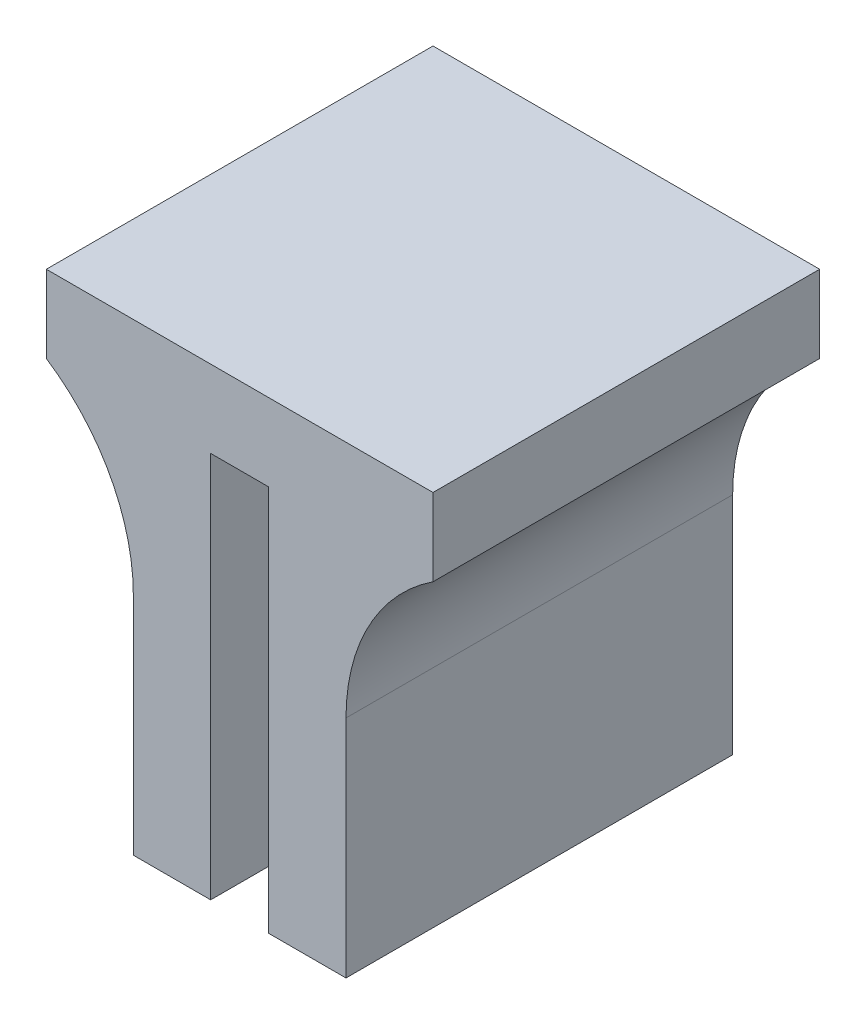
ISO-10303-21;
HEADER;
FILE_DESCRIPTION(('STEP AP214'),'2;1');
FILE_NAME('part.step','',(''),(''),'','','');
FILE_SCHEMA(('AUTOMOTIVE_DESIGN { 1 0 10303 214 1 1 1 1 }'));
ENDSEC;
DATA;
#1=APPLICATION_CONTEXT('core data for automotive mechanical design processes');
#2=APPLICATION_PROTOCOL_DEFINITION('international standard','automotive_design',2000,#1);
#3=PRODUCT_CONTEXT('',#1,'mechanical');
#4=PRODUCT('Part','Part','',(#3));
#5=PRODUCT_RELATED_PRODUCT_CATEGORY('part','',(#4));
#6=PRODUCT_DEFINITION_FORMATION('','',#4);
#7=PRODUCT_DEFINITION_CONTEXT('part definition',#1,'design');
#8=PRODUCT_DEFINITION('design','',#6,#7);
#9=PRODUCT_DEFINITION_SHAPE('','',#8);
#10=(LENGTH_UNIT() NAMED_UNIT(*) SI_UNIT(.MILLI.,.METRE.));
#11=(NAMED_UNIT(*) PLANE_ANGLE_UNIT() SI_UNIT($,.RADIAN.));
#12=(NAMED_UNIT(*) SI_UNIT($,.STERADIAN.) SOLID_ANGLE_UNIT());
#13=UNCERTAINTY_MEASURE_WITH_UNIT(LENGTH_MEASURE(1.E-05),#10,'distance_accuracy_value','');
#14=(GEOMETRIC_REPRESENTATION_CONTEXT(3) GLOBAL_UNCERTAINTY_ASSIGNED_CONTEXT((#13)) GLOBAL_UNIT_ASSIGNED_CONTEXT((#10,
#11,#12)) REPRESENTATION_CONTEXT('',''));
#15=CARTESIAN_POINT('',(0.,0.,0.));
#16=DIRECTION('',(0.,0.,1.));
#17=DIRECTION('',(1.,0.,0.));
#18=AXIS2_PLACEMENT_3D('',#15,#16,#17);
#19=CARTESIAN_POINT('',(-4.,0.,20.));
#20=DIRECTION('',(0.,1.,0.));
#21=DIRECTION('',(0.,0.,1.));
#22=AXIS2_PLACEMENT_3D('',#19,#20,#21);
#23=PLANE('',#22);
#24=DIRECTION('',(1.,0.,0.));
#25=VECTOR('',#24,1.);
#26=CARTESIAN_POINT('',(-4.,0.,0.));
#27=LINE('',#26,#25);
#28=CARTESIAN_POINT('',(-4.,0.,0.));
#29=VERTEX_POINT('',#28);
#30=CARTESIAN_POINT('',(0.,0.,0.));
#31=VERTEX_POINT('',#30);
#32=EDGE_CURVE('E154',#29,#31,#27,.T.);
#33=ORIENTED_EDGE('',*,*,#32,.T.);
#34=DIRECTION('',(0.,0.,-1.));
#35=VECTOR('',#34,1.);
#36=CARTESIAN_POINT('',(0.,0.,20.));
#37=LINE('',#36,#35);
#38=CARTESIAN_POINT('',(0.,0.,20.));
#39=VERTEX_POINT('',#38);
#40=EDGE_CURVE('E133',#39,#31,#37,.T.);
#41=ORIENTED_EDGE('',*,*,#40,.F.);
#42=DIRECTION('',(1.,0.,0.));
#43=VECTOR('',#42,1.);
#44=CARTESIAN_POINT('',(-4.,0.,20.));
#45=LINE('',#44,#43);
#46=CARTESIAN_POINT('',(-4.,0.,20.));
#47=VERTEX_POINT('',#46);
#48=EDGE_CURVE('E141',#47,#39,#45,.T.);
#49=ORIENTED_EDGE('',*,*,#48,.F.);
#50=DIRECTION('',(0.,0.,-1.));
#51=VECTOR('',#50,1.);
#52=CARTESIAN_POINT('',(-4.,0.,20.));
#53=LINE('',#52,#51);
#54=EDGE_CURVE('E184',#47,#29,#53,.T.);
#55=ORIENTED_EDGE('',*,*,#54,.T.);
#56=EDGE_LOOP('',(#33,#41,#49,#55));
#57=FACE_BOUND('',#56,.T.);
#58=ADVANCED_FACE('F39',(#57),#23,.F.);
#59=CARTESIAN_POINT('',(0.,0.,20.));
#60=DIRECTION('',(-1.,0.,0.));
#61=DIRECTION('',(0.,0.,1.));
#62=AXIS2_PLACEMENT_3D('',#59,#60,#61);
#63=PLANE('',#62);
#64=DIRECTION('',(0.,1.,0.));
#65=VECTOR('',#64,1.);
#66=CARTESIAN_POINT('',(0.,0.,0.));
#67=LINE('',#66,#65);
#68=CARTESIAN_POINT('',(0.,20.,0.));
#69=VERTEX_POINT('',#68);
#70=EDGE_CURVE('E251',#31,#69,#67,.T.);
#71=ORIENTED_EDGE('',*,*,#70,.T.);
#72=DIRECTION('',(0.,0.,-1.));
#73=VECTOR('',#72,1.);
#74=CARTESIAN_POINT('',(0.,20.,20.));
#75=LINE('',#74,#73);
#76=CARTESIAN_POINT('',(0.,20.,20.));
#77=VERTEX_POINT('',#76);
#78=EDGE_CURVE('E136',#77,#69,#75,.T.);
#79=ORIENTED_EDGE('',*,*,#78,.F.);
#80=DIRECTION('',(0.,1.,0.));
#81=VECTOR('',#80,1.);
#82=CARTESIAN_POINT('',(0.,0.,20.));
#83=LINE('',#82,#81);
#84=EDGE_CURVE('E129',#39,#77,#83,.T.);
#85=ORIENTED_EDGE('',*,*,#84,.F.);
#86=ORIENTED_EDGE('',*,*,#40,.T.);
#87=EDGE_LOOP('',(#71,#79,#85,#86));
#88=FACE_BOUND('',#87,.T.);
#89=ADVANCED_FACE('F131',(#88),#63,.F.);
#90=CARTESIAN_POINT('',(0.,20.,20.));
#91=DIRECTION('',(0.,1.,0.));
#92=DIRECTION('',(0.,0.,1.));
#93=AXIS2_PLACEMENT_3D('',#90,#91,#92);
#94=PLANE('',#93);
#95=DIRECTION('',(1.,0.,0.));
#96=VECTOR('',#95,1.);
#97=CARTESIAN_POINT('',(0.,20.,0.));
#98=LINE('',#97,#96);
#99=CARTESIAN_POINT('',(3.,20.,0.));
#100=VERTEX_POINT('',#99);
#101=EDGE_CURVE('E243',#69,#100,#98,.T.);
#102=ORIENTED_EDGE('',*,*,#101,.T.);
#103=DIRECTION('',(0.,0.,-1.));
#104=VECTOR('',#103,1.);
#105=CARTESIAN_POINT('',(3.,20.,20.));
#106=LINE('',#105,#104);
#107=CARTESIAN_POINT('',(3.,20.,20.));
#108=VERTEX_POINT('',#107);
#109=EDGE_CURVE('E162',#108,#100,#106,.T.);
#110=ORIENTED_EDGE('',*,*,#109,.F.);
#111=DIRECTION('',(1.,0.,0.));
#112=VECTOR('',#111,1.);
#113=CARTESIAN_POINT('',(0.,20.,20.));
#114=LINE('',#113,#112);
#115=EDGE_CURVE('E140',#77,#108,#114,.T.);
#116=ORIENTED_EDGE('',*,*,#115,.F.);
#117=ORIENTED_EDGE('',*,*,#78,.T.);
#118=EDGE_LOOP('',(#102,#110,#116,#117));
#119=FACE_BOUND('',#118,.T.);
#120=ADVANCED_FACE('F278',(#119),#94,.F.);
#121=CARTESIAN_POINT('',(3.,20.,20.));
#122=DIRECTION('',(1.,0.,0.));
#123=DIRECTION('',(0.,1.,0.));
#124=AXIS2_PLACEMENT_3D('',#121,#122,#123);
#125=PLANE('',#124);
#126=DIRECTION('',(0.,-1.,0.));
#127=VECTOR('',#126,1.);
#128=CARTESIAN_POINT('',(3.,20.,0.));
#129=LINE('',#128,#127);
#130=CARTESIAN_POINT('',(3.,0.,0.));
#131=VERTEX_POINT('',#130);
#132=EDGE_CURVE('E238',#100,#131,#129,.T.);
#133=ORIENTED_EDGE('',*,*,#132,.T.);
#134=DIRECTION('',(0.,0.,-1.));
#135=VECTOR('',#134,1.);
#136=CARTESIAN_POINT('',(3.,0.,20.));
#137=LINE('',#136,#135);
#138=CARTESIAN_POINT('',(3.,0.,20.));
#139=VERTEX_POINT('',#138);
#140=EDGE_CURVE('E227',#139,#131,#137,.T.);
#141=ORIENTED_EDGE('',*,*,#140,.F.);
#142=DIRECTION('',(0.,-1.,0.));
#143=VECTOR('',#142,1.);
#144=CARTESIAN_POINT('',(3.,20.,20.));
#145=LINE('',#144,#143);
#146=EDGE_CURVE('E239',#108,#139,#145,.T.);
#147=ORIENTED_EDGE('',*,*,#146,.F.);
#148=ORIENTED_EDGE('',*,*,#109,.T.);
#149=EDGE_LOOP('',(#133,#141,#147,#148));
#150=FACE_BOUND('',#149,.T.);
#151=ADVANCED_FACE('F236',(#150),#125,.F.);
#152=CARTESIAN_POINT('',(3.,0.,20.));
#153=DIRECTION('',(0.,1.,0.));
#154=DIRECTION('',(-1.,0.,0.));
#155=AXIS2_PLACEMENT_3D('',#152,#153,#154);
#156=PLANE('',#155);
#157=DIRECTION('',(1.,0.,0.));
#158=VECTOR('',#157,1.);
#159=CARTESIAN_POINT('',(3.,0.,0.));
#160=LINE('',#159,#158);
#161=CARTESIAN_POINT('',(7.,0.,0.));
#162=VERTEX_POINT('',#161);
#163=EDGE_CURVE('E244',#131,#162,#160,.T.);
#164=ORIENTED_EDGE('',*,*,#163,.T.);
#165=DIRECTION('',(0.,0.,-1.));
#166=VECTOR('',#165,1.);
#167=CARTESIAN_POINT('',(7.,0.,20.));
#168=LINE('',#167,#166);
#169=CARTESIAN_POINT('',(7.,0.,20.));
#170=VERTEX_POINT('',#169);
#171=EDGE_CURVE('E223',#170,#162,#168,.T.);
#172=ORIENTED_EDGE('',*,*,#171,.F.);
#173=DIRECTION('',(1.,0.,0.));
#174=VECTOR('',#173,1.);
#175=CARTESIAN_POINT('',(3.,0.,20.));
#176=LINE('',#175,#174);
#177=EDGE_CURVE('E282',#139,#170,#176,.T.);
#178=ORIENTED_EDGE('',*,*,#177,.F.);
#179=ORIENTED_EDGE('',*,*,#140,.T.);
#180=EDGE_LOOP('',(#164,#172,#178,#179));
#181=FACE_BOUND('',#180,.T.);
#182=ADVANCED_FACE('F306',(#181),#156,.F.);
#183=CARTESIAN_POINT('',(7.,0.,20.));
#184=DIRECTION('',(-1.,0.,0.));
#185=DIRECTION('',(0.,-1.,0.));
#186=AXIS2_PLACEMENT_3D('',#183,#184,#185);
#187=PLANE('',#186);
#188=DIRECTION('',(0.,1.,0.));
#189=VECTOR('',#188,1.);
#190=CARTESIAN_POINT('',(7.,0.,0.));
#191=LINE('',#190,#189);
#192=CARTESIAN_POINT('',(7.,11.648353455755,0.));
#193=VERTEX_POINT('',#192);
#194=EDGE_CURVE('E249',#162,#193,#191,.T.);
#195=ORIENTED_EDGE('',*,*,#194,.T.);
#196=DIRECTION('',(0.,0.,1.));
#197=VECTOR('',#196,1.);
#198=CARTESIAN_POINT('',(7.,11.648353455755,20.));
#199=LINE('',#198,#197);
#200=CARTESIAN_POINT('',(7.,11.648353455755,20.));
#201=VERTEX_POINT('',#200);
#202=EDGE_CURVE('E55',#193,#201,#199,.T.);
#203=ORIENTED_EDGE('',*,*,#202,.T.);
#204=DIRECTION('',(0.,1.,0.));
#205=VECTOR('',#204,1.);
#206=CARTESIAN_POINT('',(7.,0.,20.));
#207=LINE('',#206,#205);
#208=EDGE_CURVE('E272',#170,#201,#207,.T.);
#209=ORIENTED_EDGE('',*,*,#208,.F.);
#210=ORIENTED_EDGE('',*,*,#171,.T.);
#211=EDGE_LOOP('',(#195,#203,#209,#210));
#212=FACE_BOUND('',#211,.T.);
#213=ADVANCED_FACE('F309',(#212),#187,.F.);
#214=CARTESIAN_POINT('',(11.5,20.,20.));
#215=DIRECTION('',(-1.,0.,0.));
#216=DIRECTION('',(0.,-1.,0.));
#217=AXIS2_PLACEMENT_3D('',#214,#215,#216);
#218=PLANE('',#217);
#219=DIRECTION('',(0.,1.,0.));
#220=VECTOR('',#219,1.);
#221=CARTESIAN_POINT('',(11.5,20.,0.));
#222=LINE('',#221,#220);
#223=CARTESIAN_POINT('',(11.5,20.,0.));
#224=VERTEX_POINT('',#223);
#225=CARTESIAN_POINT('',(11.5,24.,0.));
#226=VERTEX_POINT('',#225);
#227=EDGE_CURVE('E205',#224,#226,#222,.T.);
#228=ORIENTED_EDGE('',*,*,#227,.T.);
#229=DIRECTION('',(0.,0.,-1.));
#230=VECTOR('',#229,1.);
#231=CARTESIAN_POINT('',(11.5,24.,20.));
#232=LINE('',#231,#230);
#233=CARTESIAN_POINT('',(11.5,24.,20.));
#234=VERTEX_POINT('',#233);
#235=EDGE_CURVE('E215',#234,#226,#232,.T.);
#236=ORIENTED_EDGE('',*,*,#235,.F.);
#237=DIRECTION('',(0.,1.,0.));
#238=VECTOR('',#237,1.);
#239=CARTESIAN_POINT('',(11.5,20.,20.));
#240=LINE('',#239,#238);
#241=CARTESIAN_POINT('',(11.5,20.,20.));
#242=VERTEX_POINT('',#241);
#243=EDGE_CURVE('E267',#242,#234,#240,.T.);
#244=ORIENTED_EDGE('',*,*,#243,.F.);
#245=DIRECTION('',(0.,0.,-1.));
#246=VECTOR('',#245,1.);
#247=CARTESIAN_POINT('',(11.5,20.,20.));
#248=LINE('',#247,#246);
#249=EDGE_CURVE('E219',#242,#224,#248,.T.);
#250=ORIENTED_EDGE('',*,*,#249,.T.);
#251=EDGE_LOOP('',(#228,#236,#244,#250));
#252=FACE_BOUND('',#251,.T.);
#253=ADVANCED_FACE('F259',(#252),#218,.F.);
#254=CARTESIAN_POINT('',(11.5,24.,20.));
#255=DIRECTION('',(0.,-1.,0.));
#256=DIRECTION('',(0.,0.,-1.));
#257=AXIS2_PLACEMENT_3D('',#254,#255,#256);
#258=PLANE('',#257);
#259=DIRECTION('',(-1.,0.,0.));
#260=VECTOR('',#259,1.);
#261=CARTESIAN_POINT('',(11.5,24.,0.));
#262=LINE('',#261,#260);
#263=CARTESIAN_POINT('',(-8.5,24.,0.));
#264=VERTEX_POINT('',#263);
#265=EDGE_CURVE('E200',#226,#264,#262,.T.);
#266=ORIENTED_EDGE('',*,*,#265,.T.);
#267=DIRECTION('',(0.,0.,-1.));
#268=VECTOR('',#267,1.);
#269=CARTESIAN_POINT('',(-8.5,24.,20.));
#270=LINE('',#269,#268);
#271=CARTESIAN_POINT('',(-8.5,24.,20.));
#272=VERTEX_POINT('',#271);
#273=EDGE_CURVE('E198',#272,#264,#270,.T.);
#274=ORIENTED_EDGE('',*,*,#273,.F.);
#275=DIRECTION('',(-1.,0.,0.));
#276=VECTOR('',#275,1.);
#277=CARTESIAN_POINT('',(11.5,24.,20.));
#278=LINE('',#277,#276);
#279=EDGE_CURVE('E265',#234,#272,#278,.T.);
#280=ORIENTED_EDGE('',*,*,#279,.F.);
#281=ORIENTED_EDGE('',*,*,#235,.T.);
#282=EDGE_LOOP('',(#266,#274,#280,#281));
#283=FACE_BOUND('',#282,.T.);
#284=ADVANCED_FACE('F264',(#283),#258,.F.);
#285=CARTESIAN_POINT('',(-8.5,24.,20.));
#286=DIRECTION('',(1.,0.,0.));
#287=DIRECTION('',(0.,0.,-1.));
#288=AXIS2_PLACEMENT_3D('',#285,#286,#287);
#289=PLANE('',#288);
#290=DIRECTION('',(0.,-1.,0.));
#291=VECTOR('',#290,1.);
#292=CARTESIAN_POINT('',(-8.5,24.,0.));
#293=LINE('',#292,#291);
#294=CARTESIAN_POINT('',(-8.5,20.,0.));
#295=VERTEX_POINT('',#294);
#296=EDGE_CURVE('E193',#264,#295,#293,.T.);
#297=ORIENTED_EDGE('',*,*,#296,.T.);
#298=DIRECTION('',(0.,0.,-1.));
#299=VECTOR('',#298,1.);
#300=CARTESIAN_POINT('',(-8.5,20.,20.));
#301=LINE('',#300,#299);
#302=CARTESIAN_POINT('',(-8.5,20.,20.));
#303=VERTEX_POINT('',#302);
#304=EDGE_CURVE('E188',#303,#295,#301,.T.);
#305=ORIENTED_EDGE('',*,*,#304,.F.);
#306=DIRECTION('',(0.,-1.,0.));
#307=VECTOR('',#306,1.);
#308=CARTESIAN_POINT('',(-8.5,24.,20.));
#309=LINE('',#308,#307);
#310=EDGE_CURVE('E176',#272,#303,#309,.T.);
#311=ORIENTED_EDGE('',*,*,#310,.F.);
#312=ORIENTED_EDGE('',*,*,#273,.T.);
#313=EDGE_LOOP('',(#297,#305,#311,#312));
#314=FACE_BOUND('',#313,.T.);
#315=ADVANCED_FACE('F196',(#314),#289,.F.);
#316=CARTESIAN_POINT('',(-4.,20.,20.));
#317=DIRECTION('',(1.,0.,0.));
#318=DIRECTION('',(0.,1.,0.));
#319=AXIS2_PLACEMENT_3D('',#316,#317,#318);
#320=PLANE('',#319);
#321=DIRECTION('',(0.,-1.,0.));
#322=VECTOR('',#321,1.);
#323=CARTESIAN_POINT('',(-4.,20.,20.));
#324=LINE('',#323,#322);
#325=CARTESIAN_POINT('',(-4.,11.648353455755,20.));
#326=VERTEX_POINT('',#325);
#327=EDGE_CURVE('E146',#326,#47,#324,.T.);
#328=ORIENTED_EDGE('',*,*,#327,.F.);
#329=DIRECTION('',(0.,0.,-1.));
#330=VECTOR('',#329,1.);
#331=CARTESIAN_POINT('',(-4.,11.648353455755,20.));
#332=LINE('',#331,#330);
#333=CARTESIAN_POINT('',(-4.,11.648353455755,0.));
#334=VERTEX_POINT('',#333);
#335=EDGE_CURVE('E156',#326,#334,#332,.T.);
#336=ORIENTED_EDGE('',*,*,#335,.T.);
#337=DIRECTION('',(0.,-1.,0.));
#338=VECTOR('',#337,1.);
#339=CARTESIAN_POINT('',(-4.,20.,0.));
#340=LINE('',#339,#338);
#341=EDGE_CURVE('E151',#334,#29,#340,.T.);
#342=ORIENTED_EDGE('',*,*,#341,.T.);
#343=ORIENTED_EDGE('',*,*,#54,.F.);
#344=EDGE_LOOP('',(#328,#336,#342,#343));
#345=FACE_BOUND('',#344,.T.);
#346=ADVANCED_FACE('F182',(#345),#320,.F.);
#347=CARTESIAN_POINT('',(0.,0.,20.));
#348=DIRECTION('',(0.,0.,1.));
#349=DIRECTION('',(1.,0.,0.));
#350=AXIS2_PLACEMENT_3D('',#347,#348,#349);
#351=PLANE('',#350);
#352=ORIENTED_EDGE('',*,*,#48,.T.);
#353=ORIENTED_EDGE('',*,*,#84,.T.);
#354=ORIENTED_EDGE('',*,*,#115,.T.);
#355=ORIENTED_EDGE('',*,*,#146,.T.);
#356=ORIENTED_EDGE('',*,*,#177,.T.);
#357=ORIENTED_EDGE('',*,*,#208,.T.);
#358=CARTESIAN_POINT('',(17.,11.648353455755,20.));
#359=DIRECTION('',(0.,0.,1.));
#360=DIRECTION('',(1.,0.,0.));
#361=AXIS2_PLACEMENT_3D('',#358,#359,#360);
#362=CIRCLE('',#361,10.);
#363=EDGE_CURVE('E11',#201,#242,#362,.F.);
#364=ORIENTED_EDGE('',*,*,#363,.T.);
#365=ORIENTED_EDGE('',*,*,#243,.T.);
#366=ORIENTED_EDGE('',*,*,#279,.T.);
#367=ORIENTED_EDGE('',*,*,#310,.T.);
#368=CARTESIAN_POINT('',(-14.,11.648353455755,20.));
#369=DIRECTION('',(0.,0.,1.));
#370=DIRECTION('',(1.,0.,0.));
#371=AXIS2_PLACEMENT_3D('',#368,#369,#370);
#372=CIRCLE('',#371,10.);
#373=EDGE_CURVE('E171',#303,#326,#372,.F.);
#374=ORIENTED_EDGE('',*,*,#373,.T.);
#375=ORIENTED_EDGE('',*,*,#327,.T.);
#376=EDGE_LOOP('',(#352,#353,#354,#355,#356,#357,#364,#365,#366,#367,#374,#375));
#377=FACE_BOUND('',#376,.T.);
#378=ADVANCED_FACE('F144',(#377),#351,.T.);
#379=CARTESIAN_POINT('',(0.,0.,0.));
#380=DIRECTION('',(0.,0.,1.));
#381=DIRECTION('',(1.,0.,0.));
#382=AXIS2_PLACEMENT_3D('',#379,#380,#381);
#383=PLANE('',#382);
#384=ORIENTED_EDGE('',*,*,#32,.F.);
#385=ORIENTED_EDGE('',*,*,#341,.F.);
#386=CARTESIAN_POINT('',(-14.,11.648353455755,0.));
#387=DIRECTION('',(0.,0.,1.));
#388=DIRECTION('',(1.,0.,0.));
#389=AXIS2_PLACEMENT_3D('',#386,#387,#388);
#390=CIRCLE('',#389,10.);
#391=EDGE_CURVE('E168',#334,#295,#390,.T.);
#392=ORIENTED_EDGE('',*,*,#391,.T.);
#393=ORIENTED_EDGE('',*,*,#296,.F.);
#394=ORIENTED_EDGE('',*,*,#265,.F.);
#395=ORIENTED_EDGE('',*,*,#227,.F.);
#396=CARTESIAN_POINT('',(17.,11.648353455755,0.));
#397=DIRECTION('',(0.,0.,1.));
#398=DIRECTION('',(1.,0.,0.));
#399=AXIS2_PLACEMENT_3D('',#396,#397,#398);
#400=CIRCLE('',#399,10.);
#401=EDGE_CURVE('E48',#224,#193,#400,.T.);
#402=ORIENTED_EDGE('',*,*,#401,.T.);
#403=ORIENTED_EDGE('',*,*,#194,.F.);
#404=ORIENTED_EDGE('',*,*,#163,.F.);
#405=ORIENTED_EDGE('',*,*,#132,.F.);
#406=ORIENTED_EDGE('',*,*,#101,.F.);
#407=ORIENTED_EDGE('',*,*,#70,.F.);
#408=EDGE_LOOP('',(#384,#385,#392,#393,#394,#395,#402,#403,#404,#405,#406,#407));
#409=FACE_BOUND('',#408,.T.);
#410=ADVANCED_FACE('F191',(#409),#383,.F.);
#411=CARTESIAN_POINT('',(-14.,11.648353455755,20.));
#412=DIRECTION('',(0.,0.,-1.));
#413=DIRECTION('',(-1.,0.,0.));
#414=AXIS2_PLACEMENT_3D('',#411,#412,#413);
#415=CYLINDRICAL_SURFACE('',#414,10.);
#416=ORIENTED_EDGE('',*,*,#373,.F.);
#417=ORIENTED_EDGE('',*,*,#304,.T.);
#418=ORIENTED_EDGE('',*,*,#391,.F.);
#419=ORIENTED_EDGE('',*,*,#335,.F.);
#420=EDGE_LOOP('',(#416,#417,#418,#419));
#421=FACE_BOUND('',#420,.T.);
#422=ADVANCED_FACE('F187',(#421),#415,.F.);
#423=CARTESIAN_POINT('',(17.,11.648353455755,20.));
#424=DIRECTION('',(0.,0.,1.));
#425=DIRECTION('',(1.,0.,0.));
#426=AXIS2_PLACEMENT_3D('',#423,#424,#425);
#427=CYLINDRICAL_SURFACE('',#426,10.);
#428=ORIENTED_EDGE('',*,*,#363,.F.);
#429=ORIENTED_EDGE('',*,*,#202,.F.);
#430=ORIENTED_EDGE('',*,*,#401,.F.);
#431=ORIENTED_EDGE('',*,*,#249,.F.);
#432=EDGE_LOOP('',(#428,#429,#430,#431));
#433=FACE_BOUND('',#432,.T.);
#434=ADVANCED_FACE('F41',(#433),#427,.F.);
#435=CLOSED_SHELL('',(#58,#89,#120,#151,#182,#213,#253,#284,#315,#346,#378,#410,#422,#434));
#436=MANIFOLD_SOLID_BREP('B2',#435);
#437=ADVANCED_BREP_SHAPE_REPRESENTATION('',(#18,#436),#14);
#438=SHAPE_DEFINITION_REPRESENTATION(#9,#437);
ENDSEC;
END-ISO-10303-21;
